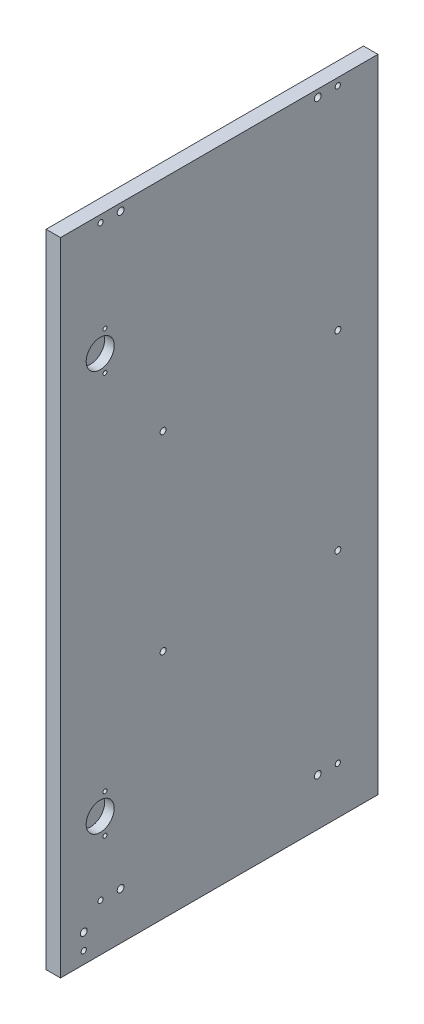
ISO-10303-21;
HEADER;
FILE_DESCRIPTION(('STEP AP214'),'2;1');
FILE_NAME('part.step','',(''),(''),'','','');
FILE_SCHEMA(('AUTOMOTIVE_DESIGN { 1 0 10303 214 1 1 1 1 }'));
ENDSEC;
DATA;
#1=APPLICATION_CONTEXT('core data for automotive mechanical design processes');
#2=APPLICATION_PROTOCOL_DEFINITION('international standard','automotive_design',2000,#1);
#3=PRODUCT_CONTEXT('',#1,'mechanical');
#4=PRODUCT('Part','Part','',(#3));
#5=PRODUCT_RELATED_PRODUCT_CATEGORY('part','',(#4));
#6=PRODUCT_DEFINITION_FORMATION('','',#4);
#7=PRODUCT_DEFINITION_CONTEXT('part definition',#1,'design');
#8=PRODUCT_DEFINITION('design','',#6,#7);
#9=PRODUCT_DEFINITION_SHAPE('','',#8);
#10=(LENGTH_UNIT() NAMED_UNIT(*) SI_UNIT(.MILLI.,.METRE.));
#11=(NAMED_UNIT(*) PLANE_ANGLE_UNIT() SI_UNIT($,.RADIAN.));
#12=(NAMED_UNIT(*) SI_UNIT($,.STERADIAN.) SOLID_ANGLE_UNIT());
#13=UNCERTAINTY_MEASURE_WITH_UNIT(LENGTH_MEASURE(1.E-05),#10,'distance_accuracy_value','');
#14=(GEOMETRIC_REPRESENTATION_CONTEXT(3) GLOBAL_UNCERTAINTY_ASSIGNED_CONTEXT((#13)) GLOBAL_UNIT_ASSIGNED_CONTEXT((#10,
#11,#12)) REPRESENTATION_CONTEXT('',''));
#15=CARTESIAN_POINT('',(0.,0.,0.));
#16=DIRECTION('',(0.,0.,1.));
#17=DIRECTION('',(1.,0.,0.));
#18=AXIS2_PLACEMENT_3D('',#15,#16,#17);
#19=CARTESIAN_POINT('',(0.,396.408879819814,-396.));
#20=DIRECTION('',(-1.,0.,0.));
#21=DIRECTION('',(0.,0.,1.));
#22=AXIS2_PLACEMENT_3D('',#19,#20,#21);
#23=PLANE('',#22);
#24=CARTESIAN_POINT('',(0.,-174.,-55.5));
#25=DIRECTION('',(1.,0.,0.));
#26=DIRECTION('',(0.,0.,-1.));
#27=AXIS2_PLACEMENT_3D('',#24,#25,#26);
#28=CIRCLE('',#27,2.5);
#29=CARTESIAN_POINT('',(0.,-174.,-58.));
#30=VERTEX_POINT('',#29);
#31=EDGE_CURVE('E223',#30,#30,#28,.T.);
#32=ORIENTED_EDGE('',*,*,#31,.F.);
#33=EDGE_LOOP('',(#32));
#34=FACE_BOUND('',#33,.T.);
#35=CARTESIAN_POINT('',(0.,-126.,-55.5));
#36=DIRECTION('',(1.,0.,0.));
#37=DIRECTION('',(0.,0.,-1.));
#38=AXIS2_PLACEMENT_3D('',#35,#36,#37);
#39=CIRCLE('',#38,2.5);
#40=CARTESIAN_POINT('',(0.,-126.,-58.));
#41=VERTEX_POINT('',#40);
#42=EDGE_CURVE('E217',#41,#41,#39,.T.);
#43=ORIENTED_EDGE('',*,*,#42,.F.);
#44=EDGE_LOOP('',(#43));
#45=FACE_BOUND('',#44,.T.);
#46=CARTESIAN_POINT('',(0.,-150.,-49.5));
#47=DIRECTION('',(1.,0.,0.));
#48=DIRECTION('',(0.,0.,-1.));
#49=AXIS2_PLACEMENT_3D('',#46,#47,#48);
#50=CIRCLE('',#49,17.5);
#51=CARTESIAN_POINT('',(0.,-150.,-67.));
#52=VERTEX_POINT('',#51);
#53=EDGE_CURVE('E211',#52,#52,#50,.T.);
#54=ORIENTED_EDGE('',*,*,#53,.F.);
#55=EDGE_LOOP('',(#54));
#56=FACE_BOUND('',#55,.T.);
#57=CARTESIAN_POINT('',(0.,-674.,-55.5));
#58=DIRECTION('',(1.,0.,0.));
#59=DIRECTION('',(0.,0.,-1.));
#60=AXIS2_PLACEMENT_3D('',#57,#58,#59);
#61=CIRCLE('',#60,2.5);
#62=CARTESIAN_POINT('',(0.,-674.,-58.));
#63=VERTEX_POINT('',#62);
#64=EDGE_CURVE('E205',#63,#63,#61,.T.);
#65=ORIENTED_EDGE('',*,*,#64,.F.);
#66=EDGE_LOOP('',(#65));
#67=FACE_BOUND('',#66,.T.);
#68=CARTESIAN_POINT('',(0.,-626.,-55.5));
#69=DIRECTION('',(1.,0.,0.));
#70=DIRECTION('',(0.,0.,-1.));
#71=AXIS2_PLACEMENT_3D('',#68,#69,#70);
#72=CIRCLE('',#71,2.5);
#73=CARTESIAN_POINT('',(0.,-626.,-58.));
#74=VERTEX_POINT('',#73);
#75=EDGE_CURVE('E199',#74,#74,#72,.T.);
#76=ORIENTED_EDGE('',*,*,#75,.F.);
#77=EDGE_LOOP('',(#76));
#78=FACE_BOUND('',#77,.T.);
#79=CARTESIAN_POINT('',(0.,-650.,-49.5));
#80=DIRECTION('',(1.,0.,0.));
#81=DIRECTION('',(0.,0.,-1.));
#82=AXIS2_PLACEMENT_3D('',#79,#80,#81);
#83=CIRCLE('',#82,17.5);
#84=CARTESIAN_POINT('',(0.,-650.,-67.));
#85=VERTEX_POINT('',#84);
#86=EDGE_CURVE('E193',#85,#85,#83,.T.);
#87=ORIENTED_EDGE('',*,*,#86,.F.);
#88=EDGE_LOOP('',(#87));
#89=FACE_BOUND('',#88,.T.);
#90=CARTESIAN_POINT('',(0.,-785.,-29.));
#91=DIRECTION('',(1.,0.,0.));
#92=DIRECTION('',(0.,0.,-1.));
#93=AXIS2_PLACEMENT_3D('',#90,#91,#92);
#94=CIRCLE('',#93,3.24999999999997);
#95=CARTESIAN_POINT('',(0.,-785.,-32.25));
#96=VERTEX_POINT('',#95);
#97=EDGE_CURVE('E187',#96,#96,#94,.T.);
#98=ORIENTED_EDGE('',*,*,#97,.F.);
#99=EDGE_LOOP('',(#98));
#100=FACE_BOUND('',#99,.T.);
#101=CARTESIAN_POINT('',(0.,-765.,-29.));
#102=DIRECTION('',(1.,0.,0.));
#103=DIRECTION('',(0.,0.,-1.));
#104=AXIS2_PLACEMENT_3D('',#101,#102,#103);
#105=CIRCLE('',#104,4.24999999999997);
#106=CARTESIAN_POINT('',(0.,-765.,-33.25));
#107=VERTEX_POINT('',#106);
#108=EDGE_CURVE('E181',#107,#107,#105,.T.);
#109=ORIENTED_EDGE('',*,*,#108,.F.);
#110=EDGE_LOOP('',(#109));
#111=FACE_BOUND('',#110,.T.);
#112=CARTESIAN_POINT('',(0.,-741.,-346.));
#113=DIRECTION('',(1.,0.,0.));
#114=DIRECTION('',(0.,0.,-1.));
#115=AXIS2_PLACEMENT_3D('',#112,#113,#114);
#116=CIRCLE('',#115,3.24999999999989);
#117=CARTESIAN_POINT('',(0.,-741.,-349.25));
#118=VERTEX_POINT('',#117);
#119=EDGE_CURVE('E175',#118,#118,#116,.T.);
#120=ORIENTED_EDGE('',*,*,#119,.F.);
#121=EDGE_LOOP('',(#120));
#122=FACE_BOUND('',#121,.T.);
#123=CARTESIAN_POINT('',(0.,-741.,-321.));
#124=DIRECTION('',(1.,0.,0.));
#125=DIRECTION('',(0.,0.,-1.));
#126=AXIS2_PLACEMENT_3D('',#123,#124,#125);
#127=CIRCLE('',#126,4.24999999999994);
#128=CARTESIAN_POINT('',(0.,-741.,-325.25));
#129=VERTEX_POINT('',#128);
#130=EDGE_CURVE('E169',#129,#129,#127,.T.);
#131=ORIENTED_EDGE('',*,*,#130,.F.);
#132=EDGE_LOOP('',(#131));
#133=FACE_BOUND('',#132,.T.);
#134=CARTESIAN_POINT('',(0.,-741.,-75.));
#135=DIRECTION('',(1.,0.,0.));
#136=DIRECTION('',(0.,0.,-1.));
#137=AXIS2_PLACEMENT_3D('',#134,#135,#136);
#138=CIRCLE('',#137,4.24999999999996);
#139=CARTESIAN_POINT('',(0.,-741.,-79.25));
#140=VERTEX_POINT('',#139);
#141=EDGE_CURVE('E163',#140,#140,#138,.T.);
#142=ORIENTED_EDGE('',*,*,#141,.F.);
#143=EDGE_LOOP('',(#142));
#144=FACE_BOUND('',#143,.T.);
#145=CARTESIAN_POINT('',(0.,-741.,-50.));
#146=DIRECTION('',(1.,0.,0.));
#147=DIRECTION('',(0.,0.,-1.));
#148=AXIS2_PLACEMENT_3D('',#145,#146,#147);
#149=CIRCLE('',#148,3.24999999999997);
#150=CARTESIAN_POINT('',(0.,-741.,-53.25));
#151=VERTEX_POINT('',#150);
#152=EDGE_CURVE('E157',#151,#151,#149,.T.);
#153=ORIENTED_EDGE('',*,*,#152,.F.);
#154=EDGE_LOOP('',(#153));
#155=FACE_BOUND('',#154,.T.);
#156=CARTESIAN_POINT('',(0.,-9.,-321.));
#157=DIRECTION('',(1.,0.,0.));
#158=DIRECTION('',(0.,0.,-1.));
#159=AXIS2_PLACEMENT_3D('',#156,#157,#158);
#160=CIRCLE('',#159,4.24999999999995);
#161=CARTESIAN_POINT('',(0.,-9.,-325.25));
#162=VERTEX_POINT('',#161);
#163=EDGE_CURVE('E151',#162,#162,#160,.T.);
#164=ORIENTED_EDGE('',*,*,#163,.F.);
#165=EDGE_LOOP('',(#164));
#166=FACE_BOUND('',#165,.T.);
#167=CARTESIAN_POINT('',(0.,-9.,-75.));
#168=DIRECTION('',(1.,0.,0.));
#169=DIRECTION('',(0.,0.,-1.));
#170=AXIS2_PLACEMENT_3D('',#167,#168,#169);
#171=CIRCLE('',#170,4.25000000000001);
#172=CARTESIAN_POINT('',(0.,-9.,-79.25));
#173=VERTEX_POINT('',#172);
#174=EDGE_CURVE('E145',#173,#173,#171,.T.);
#175=ORIENTED_EDGE('',*,*,#174,.F.);
#176=EDGE_LOOP('',(#175));
#177=FACE_BOUND('',#176,.T.);
#178=CARTESIAN_POINT('',(0.,-9.,-346.));
#179=DIRECTION('',(1.,0.,0.));
#180=DIRECTION('',(0.,0.,-1.));
#181=AXIS2_PLACEMENT_3D('',#178,#179,#180);
#182=CIRCLE('',#181,3.24999999999995);
#183=CARTESIAN_POINT('',(0.,-9.,-349.25));
#184=VERTEX_POINT('',#183);
#185=EDGE_CURVE('E139',#184,#184,#182,.T.);
#186=ORIENTED_EDGE('',*,*,#185,.F.);
#187=EDGE_LOOP('',(#186));
#188=FACE_BOUND('',#187,.T.);
#189=CARTESIAN_POINT('',(0.,-9.,-50.));
#190=DIRECTION('',(1.,0.,0.));
#191=DIRECTION('',(0.,0.,-1.));
#192=AXIS2_PLACEMENT_3D('',#189,#190,#191);
#193=CIRCLE('',#192,3.25);
#194=CARTESIAN_POINT('',(0.,-9.,-53.25));
#195=VERTEX_POINT('',#194);
#196=EDGE_CURVE('E133',#195,#195,#193,.T.);
#197=ORIENTED_EDGE('',*,*,#196,.F.);
#198=EDGE_LOOP('',(#197));
#199=FACE_BOUND('',#198,.T.);
#200=CARTESIAN_POINT('',(0.,-273.,-128.));
#201=DIRECTION('',(1.,0.,0.));
#202=DIRECTION('',(0.,0.,-1.));
#203=AXIS2_PLACEMENT_3D('',#200,#201,#202);
#204=CIRCLE('',#203,3.75000000000001);
#205=CARTESIAN_POINT('',(0.,-273.,-131.75));
#206=VERTEX_POINT('',#205);
#207=EDGE_CURVE('E127',#206,#206,#204,.T.);
#208=ORIENTED_EDGE('',*,*,#207,.F.);
#209=EDGE_LOOP('',(#208));
#210=FACE_BOUND('',#209,.T.);
#211=CARTESIAN_POINT('',(0.,-273.,-346.));
#212=DIRECTION('',(1.,0.,0.));
#213=DIRECTION('',(0.,0.,-1.));
#214=AXIS2_PLACEMENT_3D('',#211,#212,#213);
#215=CIRCLE('',#214,3.74999999999998);
#216=CARTESIAN_POINT('',(0.,-273.,-349.75));
#217=VERTEX_POINT('',#216);
#218=EDGE_CURVE('E121',#217,#217,#215,.T.);
#219=ORIENTED_EDGE('',*,*,#218,.F.);
#220=EDGE_LOOP('',(#219));
#221=FACE_BOUND('',#220,.T.);
#222=CARTESIAN_POINT('',(0.,-511.,-346.));
#223=DIRECTION('',(1.,0.,0.));
#224=DIRECTION('',(0.,0.,-1.));
#225=AXIS2_PLACEMENT_3D('',#222,#223,#224);
#226=CIRCLE('',#225,3.74999999999996);
#227=CARTESIAN_POINT('',(0.,-511.,-349.75));
#228=VERTEX_POINT('',#227);
#229=EDGE_CURVE('E115',#228,#228,#226,.T.);
#230=ORIENTED_EDGE('',*,*,#229,.F.);
#231=EDGE_LOOP('',(#230));
#232=FACE_BOUND('',#231,.T.);
#233=CARTESIAN_POINT('',(0.,-511.,-128.));
#234=DIRECTION('',(1.,0.,0.));
#235=DIRECTION('',(0.,0.,-1.));
#236=AXIS2_PLACEMENT_3D('',#233,#234,#235);
#237=CIRCLE('',#236,3.74999999999999);
#238=CARTESIAN_POINT('',(0.,-511.,-131.75));
#239=VERTEX_POINT('',#238);
#240=EDGE_CURVE('E109',#239,#239,#237,.T.);
#241=ORIENTED_EDGE('',*,*,#240,.F.);
#242=EDGE_LOOP('',(#241));
#243=FACE_BOUND('',#242,.T.);
#244=DIRECTION('',(0.,0.,-1.));
#245=VECTOR('',#244,1.);
#246=CARTESIAN_POINT('',(0.,0.,-396.));
#247=LINE('',#246,#245);
#248=CARTESIAN_POINT('',(0.,0.,0.));
#249=VERTEX_POINT('',#248);
#250=CARTESIAN_POINT('',(0.,0.,-396.));
#251=VERTEX_POINT('',#250);
#252=EDGE_CURVE('E85',#249,#251,#247,.T.);
#253=ORIENTED_EDGE('',*,*,#252,.F.);
#254=DIRECTION('',(0.,-1.,0.));
#255=VECTOR('',#254,1.);
#256=CARTESIAN_POINT('',(0.,396.408879819814,0.));
#257=LINE('',#256,#255);
#258=CARTESIAN_POINT('',(0.,-800.,0.));
#259=VERTEX_POINT('',#258);
#260=EDGE_CURVE('E39',#249,#259,#257,.T.);
#261=ORIENTED_EDGE('',*,*,#260,.T.);
#262=DIRECTION('',(0.,0.,-1.));
#263=VECTOR('',#262,1.);
#264=CARTESIAN_POINT('',(0.,-800.,-396.));
#265=LINE('',#264,#263);
#266=CARTESIAN_POINT('',(0.,-800.,-396.));
#267=VERTEX_POINT('',#266);
#268=EDGE_CURVE('E83',#259,#267,#265,.T.);
#269=ORIENTED_EDGE('',*,*,#268,.T.);
#270=DIRECTION('',(0.,-1.,0.));
#271=VECTOR('',#270,1.);
#272=CARTESIAN_POINT('',(0.,396.408879819814,-396.));
#273=LINE('',#272,#271);
#274=EDGE_CURVE('E74',#251,#267,#273,.T.);
#275=ORIENTED_EDGE('',*,*,#274,.F.);
#276=EDGE_LOOP('',(#253,#261,#269,#275));
#277=FACE_BOUND('',#276,.T.);
#278=ADVANCED_FACE('F35',(#34,#45,#56,#67,#78,#89,#100,#111,#122,#133,#144,#155,#166,#177,#188,
#199,#210,#221,#232,#243,#277),#23,.F.);
#279=CARTESIAN_POINT('',(0.,396.408879819814,-396.));
#280=DIRECTION('',(0.,0.,1.));
#281=DIRECTION('',(1.,0.,0.));
#282=AXIS2_PLACEMENT_3D('',#279,#280,#281);
#283=PLANE('',#282);
#284=DIRECTION('',(-1.,0.,0.));
#285=VECTOR('',#284,1.);
#286=CARTESIAN_POINT('',(0.,0.,-396.));
#287=LINE('',#286,#285);
#288=CARTESIAN_POINT('',(-18.,0.,-396.));
#289=VERTEX_POINT('',#288);
#290=EDGE_CURVE('E44',#251,#289,#287,.T.);
#291=ORIENTED_EDGE('',*,*,#290,.F.);
#292=ORIENTED_EDGE('',*,*,#274,.T.);
#293=DIRECTION('',(-1.,0.,0.));
#294=VECTOR('',#293,1.);
#295=CARTESIAN_POINT('',(0.,-800.,-396.));
#296=LINE('',#295,#294);
#297=CARTESIAN_POINT('',(-18.,-800.,-396.));
#298=VERTEX_POINT('',#297);
#299=EDGE_CURVE('E96',#267,#298,#296,.T.);
#300=ORIENTED_EDGE('',*,*,#299,.T.);
#301=DIRECTION('',(0.,-1.,0.));
#302=VECTOR('',#301,1.);
#303=CARTESIAN_POINT('',(-18.,396.408879819814,-396.));
#304=LINE('',#303,#302);
#305=EDGE_CURVE('E105',#289,#298,#304,.T.);
#306=ORIENTED_EDGE('',*,*,#305,.F.);
#307=EDGE_LOOP('',(#291,#292,#300,#306));
#308=FACE_BOUND('',#307,.T.);
#309=ADVANCED_FACE('F240',(#308),#283,.F.);
#310=CARTESIAN_POINT('',(-18.,396.408879819814,-396.));
#311=DIRECTION('',(1.,0.,0.));
#312=DIRECTION('',(0.,0.,-1.));
#313=AXIS2_PLACEMENT_3D('',#310,#311,#312);
#314=PLANE('',#313);
#315=DIRECTION('',(0.,0.,1.));
#316=VECTOR('',#315,1.);
#317=CARTESIAN_POINT('',(-18.,0.,-396.));
#318=LINE('',#317,#316);
#319=CARTESIAN_POINT('',(-18.,0.,0.));
#320=VERTEX_POINT('',#319);
#321=EDGE_CURVE('E11',#289,#320,#318,.T.);
#322=ORIENTED_EDGE('',*,*,#321,.F.);
#323=ORIENTED_EDGE('',*,*,#305,.T.);
#324=DIRECTION('',(0.,0.,1.));
#325=VECTOR('',#324,1.);
#326=CARTESIAN_POINT('',(-18.,-800.,-396.));
#327=LINE('',#326,#325);
#328=CARTESIAN_POINT('',(-18.,-800.,0.));
#329=VERTEX_POINT('',#328);
#330=EDGE_CURVE('E106',#298,#329,#327,.T.);
#331=ORIENTED_EDGE('',*,*,#330,.T.);
#332=DIRECTION('',(0.,-1.,0.));
#333=VECTOR('',#332,1.);
#334=CARTESIAN_POINT('',(-18.,396.408879819814,0.));
#335=LINE('',#334,#333);
#336=EDGE_CURVE('E57',#320,#329,#335,.T.);
#337=ORIENTED_EDGE('',*,*,#336,.F.);
#338=EDGE_LOOP('',(#322,#323,#331,#337));
#339=FACE_BOUND('',#338,.T.);
#340=ADVANCED_FACE('F299',(#339),#314,.F.);
#341=CARTESIAN_POINT('',(0.,396.408879819814,0.));
#342=DIRECTION('',(0.,0.,-1.));
#343=DIRECTION('',(-1.,0.,0.));
#344=AXIS2_PLACEMENT_3D('',#341,#342,#343);
#345=PLANE('',#344);
#346=DIRECTION('',(1.,0.,0.));
#347=VECTOR('',#346,1.);
#348=CARTESIAN_POINT('',(0.,0.,0.));
#349=LINE('',#348,#347);
#350=EDGE_CURVE('E93',#320,#249,#349,.T.);
#351=ORIENTED_EDGE('',*,*,#350,.F.);
#352=ORIENTED_EDGE('',*,*,#336,.T.);
#353=DIRECTION('',(1.,0.,0.));
#354=VECTOR('',#353,1.);
#355=CARTESIAN_POINT('',(0.,-800.,0.));
#356=LINE('',#355,#354);
#357=EDGE_CURVE('E89',#329,#259,#356,.T.);
#358=ORIENTED_EDGE('',*,*,#357,.T.);
#359=ORIENTED_EDGE('',*,*,#260,.F.);
#360=EDGE_LOOP('',(#351,#352,#358,#359));
#361=FACE_BOUND('',#360,.T.);
#362=ADVANCED_FACE('F90',(#361),#345,.F.);
#363=CARTESIAN_POINT('',(0.,-800.,0.));
#364=DIRECTION('',(0.,-1.,0.));
#365=DIRECTION('',(0.,0.,-1.));
#366=AXIS2_PLACEMENT_3D('',#363,#364,#365);
#367=PLANE('',#366);
#368=ORIENTED_EDGE('',*,*,#268,.F.);
#369=ORIENTED_EDGE('',*,*,#357,.F.);
#370=ORIENTED_EDGE('',*,*,#330,.F.);
#371=ORIENTED_EDGE('',*,*,#299,.F.);
#372=EDGE_LOOP('',(#368,#369,#370,#371));
#373=FACE_BOUND('',#372,.T.);
#374=ADVANCED_FACE('F95',(#373),#367,.T.);
#375=CARTESIAN_POINT('',(0.,0.,0.));
#376=DIRECTION('',(0.,1.,0.));
#377=DIRECTION('',(0.,0.,1.));
#378=AXIS2_PLACEMENT_3D('',#375,#376,#377);
#379=PLANE('',#378);
#380=ORIENTED_EDGE('',*,*,#350,.T.);
#381=ORIENTED_EDGE('',*,*,#252,.T.);
#382=ORIENTED_EDGE('',*,*,#290,.T.);
#383=ORIENTED_EDGE('',*,*,#321,.T.);
#384=EDGE_LOOP('',(#380,#381,#382,#383));
#385=FACE_BOUND('',#384,.T.);
#386=ADVANCED_FACE('F37',(#385),#379,.T.);
#387=CARTESIAN_POINT('',(-8.,-511.,-128.));
#388=DIRECTION('',(1.,0.,0.));
#389=DIRECTION('',(0.,0.,-1.));
#390=AXIS2_PLACEMENT_3D('',#387,#388,#389);
#391=CYLINDRICAL_SURFACE('',#390,3.74999999999999);
#392=CARTESIAN_POINT('',(-8.,-511.,-128.));
#393=DIRECTION('',(1.,0.,0.));
#394=DIRECTION('',(0.,0.,-1.));
#395=AXIS2_PLACEMENT_3D('',#392,#393,#394);
#396=CIRCLE('',#395,3.74999999999999);
#397=CARTESIAN_POINT('',(-8.,-511.,-131.75));
#398=VERTEX_POINT('',#397);
#399=EDGE_CURVE('E87',#398,#398,#396,.T.);
#400=ORIENTED_EDGE('',*,*,#399,.F.);
#401=EDGE_LOOP('',(#400));
#402=FACE_BOUND('',#401,.T.);
#403=ORIENTED_EDGE('',*,*,#240,.T.);
#404=EDGE_LOOP('',(#403));
#405=FACE_BOUND('',#404,.T.);
#406=ADVANCED_FACE('F279',(#402,#405),#391,.F.);
#407=CARTESIAN_POINT('',(-8.,-511.,-128.));
#408=DIRECTION('',(1.,0.,0.));
#409=DIRECTION('',(0.,0.,-1.));
#410=AXIS2_PLACEMENT_3D('',#407,#408,#409);
#411=PLANE('',#410);
#412=ORIENTED_EDGE('',*,*,#399,.T.);
#413=EDGE_LOOP('',(#412));
#414=FACE_BOUND('',#413,.T.);
#415=ADVANCED_FACE('F281',(#414),#411,.T.);
#416=CARTESIAN_POINT('',(-8.,-511.,-346.));
#417=DIRECTION('',(1.,0.,0.));
#418=DIRECTION('',(0.,0.,-1.));
#419=AXIS2_PLACEMENT_3D('',#416,#417,#418);
#420=CYLINDRICAL_SURFACE('',#419,3.74999999999996);
#421=CARTESIAN_POINT('',(-8.,-511.,-346.));
#422=DIRECTION('',(1.,0.,0.));
#423=DIRECTION('',(0.,0.,-1.));
#424=AXIS2_PLACEMENT_3D('',#421,#422,#423);
#425=CIRCLE('',#424,3.74999999999996);
#426=CARTESIAN_POINT('',(-8.,-511.,-349.75));
#427=VERTEX_POINT('',#426);
#428=EDGE_CURVE('E112',#427,#427,#425,.T.);
#429=ORIENTED_EDGE('',*,*,#428,.F.);
#430=EDGE_LOOP('',(#429));
#431=FACE_BOUND('',#430,.T.);
#432=ORIENTED_EDGE('',*,*,#229,.T.);
#433=EDGE_LOOP('',(#432));
#434=FACE_BOUND('',#433,.T.);
#435=ADVANCED_FACE('F288',(#431,#434),#420,.F.);
#436=CARTESIAN_POINT('',(-8.,-511.,-346.));
#437=DIRECTION('',(1.,0.,0.));
#438=DIRECTION('',(0.,0.,-1.));
#439=AXIS2_PLACEMENT_3D('',#436,#437,#438);
#440=PLANE('',#439);
#441=ORIENTED_EDGE('',*,*,#428,.T.);
#442=EDGE_LOOP('',(#441));
#443=FACE_BOUND('',#442,.T.);
#444=ADVANCED_FACE('F342',(#443),#440,.T.);
#445=CARTESIAN_POINT('',(-8.,-273.,-346.));
#446=DIRECTION('',(1.,0.,0.));
#447=DIRECTION('',(0.,0.,-1.));
#448=AXIS2_PLACEMENT_3D('',#445,#446,#447);
#449=CYLINDRICAL_SURFACE('',#448,3.74999999999998);
#450=CARTESIAN_POINT('',(-8.,-273.,-346.));
#451=DIRECTION('',(1.,0.,0.));
#452=DIRECTION('',(0.,0.,-1.));
#453=AXIS2_PLACEMENT_3D('',#450,#451,#452);
#454=CIRCLE('',#453,3.74999999999998);
#455=CARTESIAN_POINT('',(-8.,-273.,-349.75));
#456=VERTEX_POINT('',#455);
#457=EDGE_CURVE('E118',#456,#456,#454,.T.);
#458=ORIENTED_EDGE('',*,*,#457,.F.);
#459=EDGE_LOOP('',(#458));
#460=FACE_BOUND('',#459,.T.);
#461=ORIENTED_EDGE('',*,*,#218,.T.);
#462=EDGE_LOOP('',(#461));
#463=FACE_BOUND('',#462,.T.);
#464=ADVANCED_FACE('F351',(#460,#463),#449,.F.);
#465=CARTESIAN_POINT('',(-8.,-273.,-346.));
#466=DIRECTION('',(1.,0.,0.));
#467=DIRECTION('',(0.,0.,-1.));
#468=AXIS2_PLACEMENT_3D('',#465,#466,#467);
#469=PLANE('',#468);
#470=ORIENTED_EDGE('',*,*,#457,.T.);
#471=EDGE_LOOP('',(#470));
#472=FACE_BOUND('',#471,.T.);
#473=ADVANCED_FACE('F361',(#472),#469,.T.);
#474=CARTESIAN_POINT('',(-8.,-273.,-128.));
#475=DIRECTION('',(1.,0.,0.));
#476=DIRECTION('',(0.,0.,-1.));
#477=AXIS2_PLACEMENT_3D('',#474,#475,#476);
#478=CYLINDRICAL_SURFACE('',#477,3.75000000000001);
#479=CARTESIAN_POINT('',(-8.,-273.,-128.));
#480=DIRECTION('',(1.,0.,0.));
#481=DIRECTION('',(0.,0.,-1.));
#482=AXIS2_PLACEMENT_3D('',#479,#480,#481);
#483=CIRCLE('',#482,3.75000000000001);
#484=CARTESIAN_POINT('',(-8.,-273.,-131.75));
#485=VERTEX_POINT('',#484);
#486=EDGE_CURVE('E124',#485,#485,#483,.T.);
#487=ORIENTED_EDGE('',*,*,#486,.F.);
#488=EDGE_LOOP('',(#487));
#489=FACE_BOUND('',#488,.T.);
#490=ORIENTED_EDGE('',*,*,#207,.T.);
#491=EDGE_LOOP('',(#490));
#492=FACE_BOUND('',#491,.T.);
#493=ADVANCED_FACE('F371',(#489,#492),#478,.F.);
#494=CARTESIAN_POINT('',(-8.,-273.,-128.));
#495=DIRECTION('',(1.,0.,0.));
#496=DIRECTION('',(0.,0.,-1.));
#497=AXIS2_PLACEMENT_3D('',#494,#495,#496);
#498=PLANE('',#497);
#499=ORIENTED_EDGE('',*,*,#486,.T.);
#500=EDGE_LOOP('',(#499));
#501=FACE_BOUND('',#500,.T.);
#502=ADVANCED_FACE('F381',(#501),#498,.T.);
#503=CARTESIAN_POINT('',(-12.,-9.,-50.));
#504=DIRECTION('',(1.,0.,0.));
#505=DIRECTION('',(0.,0.,-1.));
#506=AXIS2_PLACEMENT_3D('',#503,#504,#505);
#507=CYLINDRICAL_SURFACE('',#506,3.25);
#508=CARTESIAN_POINT('',(-12.,-9.,-50.));
#509=DIRECTION('',(1.,0.,0.));
#510=DIRECTION('',(0.,0.,-1.));
#511=AXIS2_PLACEMENT_3D('',#508,#509,#510);
#512=CIRCLE('',#511,3.25);
#513=CARTESIAN_POINT('',(-12.,-9.,-53.25));
#514=VERTEX_POINT('',#513);
#515=EDGE_CURVE('E130',#514,#514,#512,.T.);
#516=ORIENTED_EDGE('',*,*,#515,.F.);
#517=EDGE_LOOP('',(#516));
#518=FACE_BOUND('',#517,.T.);
#519=ORIENTED_EDGE('',*,*,#196,.T.);
#520=EDGE_LOOP('',(#519));
#521=FACE_BOUND('',#520,.T.);
#522=ADVANCED_FACE('F391',(#518,#521),#507,.F.);
#523=CARTESIAN_POINT('',(-12.,-9.,-50.));
#524=DIRECTION('',(1.,0.,0.));
#525=DIRECTION('',(0.,0.,-1.));
#526=AXIS2_PLACEMENT_3D('',#523,#524,#525);
#527=PLANE('',#526);
#528=ORIENTED_EDGE('',*,*,#515,.T.);
#529=EDGE_LOOP('',(#528));
#530=FACE_BOUND('',#529,.T.);
#531=ADVANCED_FACE('F401',(#530),#527,.T.);
#532=CARTESIAN_POINT('',(-12.,-9.,-346.));
#533=DIRECTION('',(1.,0.,0.));
#534=DIRECTION('',(0.,0.,-1.));
#535=AXIS2_PLACEMENT_3D('',#532,#533,#534);
#536=CYLINDRICAL_SURFACE('',#535,3.24999999999995);
#537=CARTESIAN_POINT('',(-12.,-9.,-346.));
#538=DIRECTION('',(1.,0.,0.));
#539=DIRECTION('',(0.,0.,-1.));
#540=AXIS2_PLACEMENT_3D('',#537,#538,#539);
#541=CIRCLE('',#540,3.24999999999995);
#542=CARTESIAN_POINT('',(-12.,-9.,-349.25));
#543=VERTEX_POINT('',#542);
#544=EDGE_CURVE('E136',#543,#543,#541,.T.);
#545=ORIENTED_EDGE('',*,*,#544,.F.);
#546=EDGE_LOOP('',(#545));
#547=FACE_BOUND('',#546,.T.);
#548=ORIENTED_EDGE('',*,*,#185,.T.);
#549=EDGE_LOOP('',(#548));
#550=FACE_BOUND('',#549,.T.);
#551=ADVANCED_FACE('F411',(#547,#550),#536,.F.);
#552=CARTESIAN_POINT('',(-12.,-9.,-346.));
#553=DIRECTION('',(1.,0.,0.));
#554=DIRECTION('',(0.,0.,-1.));
#555=AXIS2_PLACEMENT_3D('',#552,#553,#554);
#556=PLANE('',#555);
#557=ORIENTED_EDGE('',*,*,#544,.T.);
#558=EDGE_LOOP('',(#557));
#559=FACE_BOUND('',#558,.T.);
#560=ADVANCED_FACE('F421',(#559),#556,.T.);
#561=CARTESIAN_POINT('',(-12.,-9.,-75.));
#562=DIRECTION('',(1.,0.,0.));
#563=DIRECTION('',(0.,0.,-1.));
#564=AXIS2_PLACEMENT_3D('',#561,#562,#563);
#565=CYLINDRICAL_SURFACE('',#564,4.25000000000001);
#566=CARTESIAN_POINT('',(-12.,-9.,-75.));
#567=DIRECTION('',(1.,0.,0.));
#568=DIRECTION('',(0.,0.,-1.));
#569=AXIS2_PLACEMENT_3D('',#566,#567,#568);
#570=CIRCLE('',#569,4.25000000000001);
#571=CARTESIAN_POINT('',(-12.,-9.,-79.25));
#572=VERTEX_POINT('',#571);
#573=EDGE_CURVE('E142',#572,#572,#570,.T.);
#574=ORIENTED_EDGE('',*,*,#573,.F.);
#575=EDGE_LOOP('',(#574));
#576=FACE_BOUND('',#575,.T.);
#577=ORIENTED_EDGE('',*,*,#174,.T.);
#578=EDGE_LOOP('',(#577));
#579=FACE_BOUND('',#578,.T.);
#580=ADVANCED_FACE('F431',(#576,#579),#565,.F.);
#581=CARTESIAN_POINT('',(-12.,-9.,-75.));
#582=DIRECTION('',(1.,0.,0.));
#583=DIRECTION('',(0.,0.,-1.));
#584=AXIS2_PLACEMENT_3D('',#581,#582,#583);
#585=PLANE('',#584);
#586=ORIENTED_EDGE('',*,*,#573,.T.);
#587=EDGE_LOOP('',(#586));
#588=FACE_BOUND('',#587,.T.);
#589=ADVANCED_FACE('F441',(#588),#585,.T.);
#590=CARTESIAN_POINT('',(-12.,-9.,-321.));
#591=DIRECTION('',(1.,0.,0.));
#592=DIRECTION('',(0.,0.,-1.));
#593=AXIS2_PLACEMENT_3D('',#590,#591,#592);
#594=CYLINDRICAL_SURFACE('',#593,4.24999999999995);
#595=CARTESIAN_POINT('',(-12.,-9.,-321.));
#596=DIRECTION('',(1.,0.,0.));
#597=DIRECTION('',(0.,0.,-1.));
#598=AXIS2_PLACEMENT_3D('',#595,#596,#597);
#599=CIRCLE('',#598,4.24999999999995);
#600=CARTESIAN_POINT('',(-12.,-9.,-325.25));
#601=VERTEX_POINT('',#600);
#602=EDGE_CURVE('E148',#601,#601,#599,.T.);
#603=ORIENTED_EDGE('',*,*,#602,.F.);
#604=EDGE_LOOP('',(#603));
#605=FACE_BOUND('',#604,.T.);
#606=ORIENTED_EDGE('',*,*,#163,.T.);
#607=EDGE_LOOP('',(#606));
#608=FACE_BOUND('',#607,.T.);
#609=ADVANCED_FACE('F451',(#605,#608),#594,.F.);
#610=CARTESIAN_POINT('',(-12.,-9.,-321.));
#611=DIRECTION('',(1.,0.,0.));
#612=DIRECTION('',(0.,0.,-1.));
#613=AXIS2_PLACEMENT_3D('',#610,#611,#612);
#614=PLANE('',#613);
#615=ORIENTED_EDGE('',*,*,#602,.T.);
#616=EDGE_LOOP('',(#615));
#617=FACE_BOUND('',#616,.T.);
#618=ADVANCED_FACE('F461',(#617),#614,.T.);
#619=CARTESIAN_POINT('',(-12.,-741.,-50.));
#620=DIRECTION('',(1.,0.,0.));
#621=DIRECTION('',(0.,0.,-1.));
#622=AXIS2_PLACEMENT_3D('',#619,#620,#621);
#623=CYLINDRICAL_SURFACE('',#622,3.24999999999997);
#624=CARTESIAN_POINT('',(-12.,-741.,-50.));
#625=DIRECTION('',(1.,0.,0.));
#626=DIRECTION('',(0.,0.,-1.));
#627=AXIS2_PLACEMENT_3D('',#624,#625,#626);
#628=CIRCLE('',#627,3.24999999999997);
#629=CARTESIAN_POINT('',(-12.,-741.,-53.25));
#630=VERTEX_POINT('',#629);
#631=EDGE_CURVE('E154',#630,#630,#628,.T.);
#632=ORIENTED_EDGE('',*,*,#631,.F.);
#633=EDGE_LOOP('',(#632));
#634=FACE_BOUND('',#633,.T.);
#635=ORIENTED_EDGE('',*,*,#152,.T.);
#636=EDGE_LOOP('',(#635));
#637=FACE_BOUND('',#636,.T.);
#638=ADVANCED_FACE('F471',(#634,#637),#623,.F.);
#639=CARTESIAN_POINT('',(-12.,-741.,-50.));
#640=DIRECTION('',(1.,0.,0.));
#641=DIRECTION('',(0.,0.,-1.));
#642=AXIS2_PLACEMENT_3D('',#639,#640,#641);
#643=PLANE('',#642);
#644=ORIENTED_EDGE('',*,*,#631,.T.);
#645=EDGE_LOOP('',(#644));
#646=FACE_BOUND('',#645,.T.);
#647=ADVANCED_FACE('F481',(#646),#643,.T.);
#648=CARTESIAN_POINT('',(-12.,-741.,-75.));
#649=DIRECTION('',(1.,0.,0.));
#650=DIRECTION('',(0.,0.,-1.));
#651=AXIS2_PLACEMENT_3D('',#648,#649,#650);
#652=CYLINDRICAL_SURFACE('',#651,4.24999999999996);
#653=CARTESIAN_POINT('',(-12.,-741.,-75.));
#654=DIRECTION('',(1.,0.,0.));
#655=DIRECTION('',(0.,0.,-1.));
#656=AXIS2_PLACEMENT_3D('',#653,#654,#655);
#657=CIRCLE('',#656,4.24999999999996);
#658=CARTESIAN_POINT('',(-12.,-741.,-79.25));
#659=VERTEX_POINT('',#658);
#660=EDGE_CURVE('E160',#659,#659,#657,.T.);
#661=ORIENTED_EDGE('',*,*,#660,.F.);
#662=EDGE_LOOP('',(#661));
#663=FACE_BOUND('',#662,.T.);
#664=ORIENTED_EDGE('',*,*,#141,.T.);
#665=EDGE_LOOP('',(#664));
#666=FACE_BOUND('',#665,.T.);
#667=ADVANCED_FACE('F491',(#663,#666),#652,.F.);
#668=CARTESIAN_POINT('',(-12.,-741.,-75.));
#669=DIRECTION('',(1.,0.,0.));
#670=DIRECTION('',(0.,0.,-1.));
#671=AXIS2_PLACEMENT_3D('',#668,#669,#670);
#672=PLANE('',#671);
#673=ORIENTED_EDGE('',*,*,#660,.T.);
#674=EDGE_LOOP('',(#673));
#675=FACE_BOUND('',#674,.T.);
#676=ADVANCED_FACE('F501',(#675),#672,.T.);
#677=CARTESIAN_POINT('',(-12.,-741.,-321.));
#678=DIRECTION('',(1.,0.,0.));
#679=DIRECTION('',(0.,0.,-1.));
#680=AXIS2_PLACEMENT_3D('',#677,#678,#679);
#681=CYLINDRICAL_SURFACE('',#680,4.24999999999994);
#682=CARTESIAN_POINT('',(-12.,-741.,-321.));
#683=DIRECTION('',(1.,0.,0.));
#684=DIRECTION('',(0.,0.,-1.));
#685=AXIS2_PLACEMENT_3D('',#682,#683,#684);
#686=CIRCLE('',#685,4.24999999999994);
#687=CARTESIAN_POINT('',(-12.,-741.,-325.25));
#688=VERTEX_POINT('',#687);
#689=EDGE_CURVE('E166',#688,#688,#686,.T.);
#690=ORIENTED_EDGE('',*,*,#689,.F.);
#691=EDGE_LOOP('',(#690));
#692=FACE_BOUND('',#691,.T.);
#693=ORIENTED_EDGE('',*,*,#130,.T.);
#694=EDGE_LOOP('',(#693));
#695=FACE_BOUND('',#694,.T.);
#696=ADVANCED_FACE('F511',(#692,#695),#681,.F.);
#697=CARTESIAN_POINT('',(-12.,-741.,-321.));
#698=DIRECTION('',(1.,0.,0.));
#699=DIRECTION('',(0.,0.,-1.));
#700=AXIS2_PLACEMENT_3D('',#697,#698,#699);
#701=PLANE('',#700);
#702=ORIENTED_EDGE('',*,*,#689,.T.);
#703=EDGE_LOOP('',(#702));
#704=FACE_BOUND('',#703,.T.);
#705=ADVANCED_FACE('F521',(#704),#701,.T.);
#706=CARTESIAN_POINT('',(-12.,-741.,-346.));
#707=DIRECTION('',(1.,0.,0.));
#708=DIRECTION('',(0.,0.,-1.));
#709=AXIS2_PLACEMENT_3D('',#706,#707,#708);
#710=CYLINDRICAL_SURFACE('',#709,3.24999999999989);
#711=CARTESIAN_POINT('',(-12.,-741.,-346.));
#712=DIRECTION('',(1.,0.,0.));
#713=DIRECTION('',(0.,0.,-1.));
#714=AXIS2_PLACEMENT_3D('',#711,#712,#713);
#715=CIRCLE('',#714,3.24999999999989);
#716=CARTESIAN_POINT('',(-12.,-741.,-349.25));
#717=VERTEX_POINT('',#716);
#718=EDGE_CURVE('E172',#717,#717,#715,.T.);
#719=ORIENTED_EDGE('',*,*,#718,.F.);
#720=EDGE_LOOP('',(#719));
#721=FACE_BOUND('',#720,.T.);
#722=ORIENTED_EDGE('',*,*,#119,.T.);
#723=EDGE_LOOP('',(#722));
#724=FACE_BOUND('',#723,.T.);
#725=ADVANCED_FACE('F531',(#721,#724),#710,.F.);
#726=CARTESIAN_POINT('',(-12.,-741.,-346.));
#727=DIRECTION('',(1.,0.,0.));
#728=DIRECTION('',(0.,0.,-1.));
#729=AXIS2_PLACEMENT_3D('',#726,#727,#728);
#730=PLANE('',#729);
#731=ORIENTED_EDGE('',*,*,#718,.T.);
#732=EDGE_LOOP('',(#731));
#733=FACE_BOUND('',#732,.T.);
#734=ADVANCED_FACE('F541',(#733),#730,.T.);
#735=CARTESIAN_POINT('',(-12.,-765.,-29.));
#736=DIRECTION('',(1.,0.,0.));
#737=DIRECTION('',(0.,0.,-1.));
#738=AXIS2_PLACEMENT_3D('',#735,#736,#737);
#739=CYLINDRICAL_SURFACE('',#738,4.24999999999997);
#740=CARTESIAN_POINT('',(-12.,-765.,-29.));
#741=DIRECTION('',(1.,0.,0.));
#742=DIRECTION('',(0.,0.,-1.));
#743=AXIS2_PLACEMENT_3D('',#740,#741,#742);
#744=CIRCLE('',#743,4.24999999999997);
#745=CARTESIAN_POINT('',(-12.,-765.,-33.25));
#746=VERTEX_POINT('',#745);
#747=EDGE_CURVE('E178',#746,#746,#744,.T.);
#748=ORIENTED_EDGE('',*,*,#747,.F.);
#749=EDGE_LOOP('',(#748));
#750=FACE_BOUND('',#749,.T.);
#751=ORIENTED_EDGE('',*,*,#108,.T.);
#752=EDGE_LOOP('',(#751));
#753=FACE_BOUND('',#752,.T.);
#754=ADVANCED_FACE('F551',(#750,#753),#739,.F.);
#755=CARTESIAN_POINT('',(-12.,-765.,-29.));
#756=DIRECTION('',(1.,0.,0.));
#757=DIRECTION('',(0.,0.,-1.));
#758=AXIS2_PLACEMENT_3D('',#755,#756,#757);
#759=PLANE('',#758);
#760=ORIENTED_EDGE('',*,*,#747,.T.);
#761=EDGE_LOOP('',(#760));
#762=FACE_BOUND('',#761,.T.);
#763=ADVANCED_FACE('F561',(#762),#759,.T.);
#764=CARTESIAN_POINT('',(-12.,-785.,-29.));
#765=DIRECTION('',(1.,0.,0.));
#766=DIRECTION('',(0.,0.,-1.));
#767=AXIS2_PLACEMENT_3D('',#764,#765,#766);
#768=CYLINDRICAL_SURFACE('',#767,3.24999999999997);
#769=CARTESIAN_POINT('',(-12.,-785.,-29.));
#770=DIRECTION('',(1.,0.,0.));
#771=DIRECTION('',(0.,0.,-1.));
#772=AXIS2_PLACEMENT_3D('',#769,#770,#771);
#773=CIRCLE('',#772,3.24999999999997);
#774=CARTESIAN_POINT('',(-12.,-785.,-32.25));
#775=VERTEX_POINT('',#774);
#776=EDGE_CURVE('E184',#775,#775,#773,.T.);
#777=ORIENTED_EDGE('',*,*,#776,.F.);
#778=EDGE_LOOP('',(#777));
#779=FACE_BOUND('',#778,.T.);
#780=ORIENTED_EDGE('',*,*,#97,.T.);
#781=EDGE_LOOP('',(#780));
#782=FACE_BOUND('',#781,.T.);
#783=ADVANCED_FACE('F571',(#779,#782),#768,.F.);
#784=CARTESIAN_POINT('',(-12.,-785.,-29.));
#785=DIRECTION('',(1.,0.,0.));
#786=DIRECTION('',(0.,0.,-1.));
#787=AXIS2_PLACEMENT_3D('',#784,#785,#786);
#788=PLANE('',#787);
#789=ORIENTED_EDGE('',*,*,#776,.T.);
#790=EDGE_LOOP('',(#789));
#791=FACE_BOUND('',#790,.T.);
#792=ADVANCED_FACE('F581',(#791),#788,.T.);
#793=CARTESIAN_POINT('',(-12.,-650.,-49.5));
#794=DIRECTION('',(1.,0.,0.));
#795=DIRECTION('',(0.,0.,-1.));
#796=AXIS2_PLACEMENT_3D('',#793,#794,#795);
#797=CYLINDRICAL_SURFACE('',#796,17.5);
#798=CARTESIAN_POINT('',(-12.,-650.,-49.5));
#799=DIRECTION('',(1.,0.,0.));
#800=DIRECTION('',(0.,0.,-1.));
#801=AXIS2_PLACEMENT_3D('',#798,#799,#800);
#802=CIRCLE('',#801,17.5);
#803=CARTESIAN_POINT('',(-12.,-650.,-67.));
#804=VERTEX_POINT('',#803);
#805=EDGE_CURVE('E190',#804,#804,#802,.T.);
#806=ORIENTED_EDGE('',*,*,#805,.F.);
#807=EDGE_LOOP('',(#806));
#808=FACE_BOUND('',#807,.T.);
#809=ORIENTED_EDGE('',*,*,#86,.T.);
#810=EDGE_LOOP('',(#809));
#811=FACE_BOUND('',#810,.T.);
#812=ADVANCED_FACE('F590',(#808,#811),#797,.F.);
#813=CARTESIAN_POINT('',(-12.,-650.,-49.5));
#814=DIRECTION('',(1.,0.,0.));
#815=DIRECTION('',(0.,0.,-1.));
#816=AXIS2_PLACEMENT_3D('',#813,#814,#815);
#817=PLANE('',#816);
#818=ORIENTED_EDGE('',*,*,#805,.T.);
#819=EDGE_LOOP('',(#818));
#820=FACE_BOUND('',#819,.T.);
#821=ADVANCED_FACE('F605',(#820),#817,.T.);
#822=CARTESIAN_POINT('',(-12.,-626.,-55.5));
#823=DIRECTION('',(1.,0.,0.));
#824=DIRECTION('',(0.,0.,-1.));
#825=AXIS2_PLACEMENT_3D('',#822,#823,#824);
#826=CYLINDRICAL_SURFACE('',#825,2.5);
#827=CARTESIAN_POINT('',(-12.,-626.,-55.5));
#828=DIRECTION('',(1.,0.,0.));
#829=DIRECTION('',(0.,0.,-1.));
#830=AXIS2_PLACEMENT_3D('',#827,#828,#829);
#831=CIRCLE('',#830,2.5);
#832=CARTESIAN_POINT('',(-12.,-626.,-58.));
#833=VERTEX_POINT('',#832);
#834=EDGE_CURVE('E196',#833,#833,#831,.T.);
#835=ORIENTED_EDGE('',*,*,#834,.F.);
#836=EDGE_LOOP('',(#835));
#837=FACE_BOUND('',#836,.T.);
#838=ORIENTED_EDGE('',*,*,#75,.T.);
#839=EDGE_LOOP('',(#838));
#840=FACE_BOUND('',#839,.T.);
#841=ADVANCED_FACE('F615',(#837,#840),#826,.F.);
#842=CARTESIAN_POINT('',(-12.,-626.,-55.5));
#843=DIRECTION('',(1.,0.,0.));
#844=DIRECTION('',(0.,0.,-1.));
#845=AXIS2_PLACEMENT_3D('',#842,#843,#844);
#846=PLANE('',#845);
#847=ORIENTED_EDGE('',*,*,#834,.T.);
#848=EDGE_LOOP('',(#847));
#849=FACE_BOUND('',#848,.T.);
#850=ADVANCED_FACE('F625',(#849),#846,.T.);
#851=CARTESIAN_POINT('',(-12.,-674.,-55.5));
#852=DIRECTION('',(1.,0.,0.));
#853=DIRECTION('',(0.,0.,-1.));
#854=AXIS2_PLACEMENT_3D('',#851,#852,#853);
#855=CYLINDRICAL_SURFACE('',#854,2.5);
#856=CARTESIAN_POINT('',(-12.,-674.,-55.5));
#857=DIRECTION('',(1.,0.,0.));
#858=DIRECTION('',(0.,0.,-1.));
#859=AXIS2_PLACEMENT_3D('',#856,#857,#858);
#860=CIRCLE('',#859,2.5);
#861=CARTESIAN_POINT('',(-12.,-674.,-58.));
#862=VERTEX_POINT('',#861);
#863=EDGE_CURVE('E202',#862,#862,#860,.T.);
#864=ORIENTED_EDGE('',*,*,#863,.F.);
#865=EDGE_LOOP('',(#864));
#866=FACE_BOUND('',#865,.T.);
#867=ORIENTED_EDGE('',*,*,#64,.T.);
#868=EDGE_LOOP('',(#867));
#869=FACE_BOUND('',#868,.T.);
#870=ADVANCED_FACE('F635',(#866,#869),#855,.F.);
#871=CARTESIAN_POINT('',(-12.,-674.,-55.5));
#872=DIRECTION('',(1.,0.,0.));
#873=DIRECTION('',(0.,0.,-1.));
#874=AXIS2_PLACEMENT_3D('',#871,#872,#873);
#875=PLANE('',#874);
#876=ORIENTED_EDGE('',*,*,#863,.T.);
#877=EDGE_LOOP('',(#876));
#878=FACE_BOUND('',#877,.T.);
#879=ADVANCED_FACE('F645',(#878),#875,.T.);
#880=CARTESIAN_POINT('',(-12.,-150.,-49.5));
#881=DIRECTION('',(1.,0.,0.));
#882=DIRECTION('',(0.,0.,-1.));
#883=AXIS2_PLACEMENT_3D('',#880,#881,#882);
#884=CYLINDRICAL_SURFACE('',#883,17.5);
#885=CARTESIAN_POINT('',(-12.,-150.,-49.5));
#886=DIRECTION('',(1.,0.,0.));
#887=DIRECTION('',(0.,0.,-1.));
#888=AXIS2_PLACEMENT_3D('',#885,#886,#887);
#889=CIRCLE('',#888,17.5);
#890=CARTESIAN_POINT('',(-12.,-150.,-67.));
#891=VERTEX_POINT('',#890);
#892=EDGE_CURVE('E208',#891,#891,#889,.T.);
#893=ORIENTED_EDGE('',*,*,#892,.F.);
#894=EDGE_LOOP('',(#893));
#895=FACE_BOUND('',#894,.T.);
#896=ORIENTED_EDGE('',*,*,#53,.T.);
#897=EDGE_LOOP('',(#896));
#898=FACE_BOUND('',#897,.T.);
#899=ADVANCED_FACE('F655',(#895,#898),#884,.F.);
#900=CARTESIAN_POINT('',(-12.,-150.,-49.5));
#901=DIRECTION('',(1.,0.,0.));
#902=DIRECTION('',(0.,0.,-1.));
#903=AXIS2_PLACEMENT_3D('',#900,#901,#902);
#904=PLANE('',#903);
#905=ORIENTED_EDGE('',*,*,#892,.T.);
#906=EDGE_LOOP('',(#905));
#907=FACE_BOUND('',#906,.T.);
#908=ADVANCED_FACE('F665',(#907),#904,.T.);
#909=CARTESIAN_POINT('',(-12.,-126.,-55.5));
#910=DIRECTION('',(1.,0.,0.));
#911=DIRECTION('',(0.,0.,-1.));
#912=AXIS2_PLACEMENT_3D('',#909,#910,#911);
#913=CYLINDRICAL_SURFACE('',#912,2.5);
#914=CARTESIAN_POINT('',(-12.,-126.,-55.5));
#915=DIRECTION('',(1.,0.,0.));
#916=DIRECTION('',(0.,0.,-1.));
#917=AXIS2_PLACEMENT_3D('',#914,#915,#916);
#918=CIRCLE('',#917,2.5);
#919=CARTESIAN_POINT('',(-12.,-126.,-58.));
#920=VERTEX_POINT('',#919);
#921=EDGE_CURVE('E214',#920,#920,#918,.T.);
#922=ORIENTED_EDGE('',*,*,#921,.F.);
#923=EDGE_LOOP('',(#922));
#924=FACE_BOUND('',#923,.T.);
#925=ORIENTED_EDGE('',*,*,#42,.T.);
#926=EDGE_LOOP('',(#925));
#927=FACE_BOUND('',#926,.T.);
#928=ADVANCED_FACE('F675',(#924,#927),#913,.F.);
#929=CARTESIAN_POINT('',(-12.,-126.,-55.5));
#930=DIRECTION('',(1.,0.,0.));
#931=DIRECTION('',(0.,0.,-1.));
#932=AXIS2_PLACEMENT_3D('',#929,#930,#931);
#933=PLANE('',#932);
#934=ORIENTED_EDGE('',*,*,#921,.T.);
#935=EDGE_LOOP('',(#934));
#936=FACE_BOUND('',#935,.T.);
#937=ADVANCED_FACE('F234',(#936),#933,.T.);
#938=CARTESIAN_POINT('',(-12.,-174.,-55.5));
#939=DIRECTION('',(1.,0.,0.));
#940=DIRECTION('',(0.,0.,-1.));
#941=AXIS2_PLACEMENT_3D('',#938,#939,#940);
#942=CYLINDRICAL_SURFACE('',#941,2.5);
#943=CARTESIAN_POINT('',(-12.,-174.,-55.5));
#944=DIRECTION('',(1.,0.,0.));
#945=DIRECTION('',(0.,0.,-1.));
#946=AXIS2_PLACEMENT_3D('',#943,#944,#945);
#947=CIRCLE('',#946,2.5);
#948=CARTESIAN_POINT('',(-12.,-174.,-58.));
#949=VERTEX_POINT('',#948);
#950=EDGE_CURVE('E220',#949,#949,#947,.T.);
#951=ORIENTED_EDGE('',*,*,#950,.F.);
#952=EDGE_LOOP('',(#951));
#953=FACE_BOUND('',#952,.T.);
#954=ORIENTED_EDGE('',*,*,#31,.T.);
#955=EDGE_LOOP('',(#954));
#956=FACE_BOUND('',#955,.T.);
#957=ADVANCED_FACE('F231',(#953,#956),#942,.F.);
#958=CARTESIAN_POINT('',(-12.,-174.,-55.5));
#959=DIRECTION('',(1.,0.,0.));
#960=DIRECTION('',(0.,0.,-1.));
#961=AXIS2_PLACEMENT_3D('',#958,#959,#960);
#962=PLANE('',#961);
#963=ORIENTED_EDGE('',*,*,#950,.T.);
#964=EDGE_LOOP('',(#963));
#965=FACE_BOUND('',#964,.T.);
#966=ADVANCED_FACE('F229',(#965),#962,.T.);
#967=CLOSED_SHELL('',(#278,#309,#340,#362,#374,#386,#406,#415,#435,#444,#464,#473,#493,#502,
#522,#531,#551,#560,#580,#589,#609,#618,#638,#647,#667,#676,#696,#705,#725,#734,#754,#763,#783,
#792,#812,#821,#841,#850,#870,#879,#899,#908,#928,#937,#957,#966));
#968=MANIFOLD_SOLID_BREP('B2',#967);
#969=ADVANCED_BREP_SHAPE_REPRESENTATION('',(#18,#968),#14);
#970=SHAPE_DEFINITION_REPRESENTATION(#9,#969);
ENDSEC;
END-ISO-10303-21;
